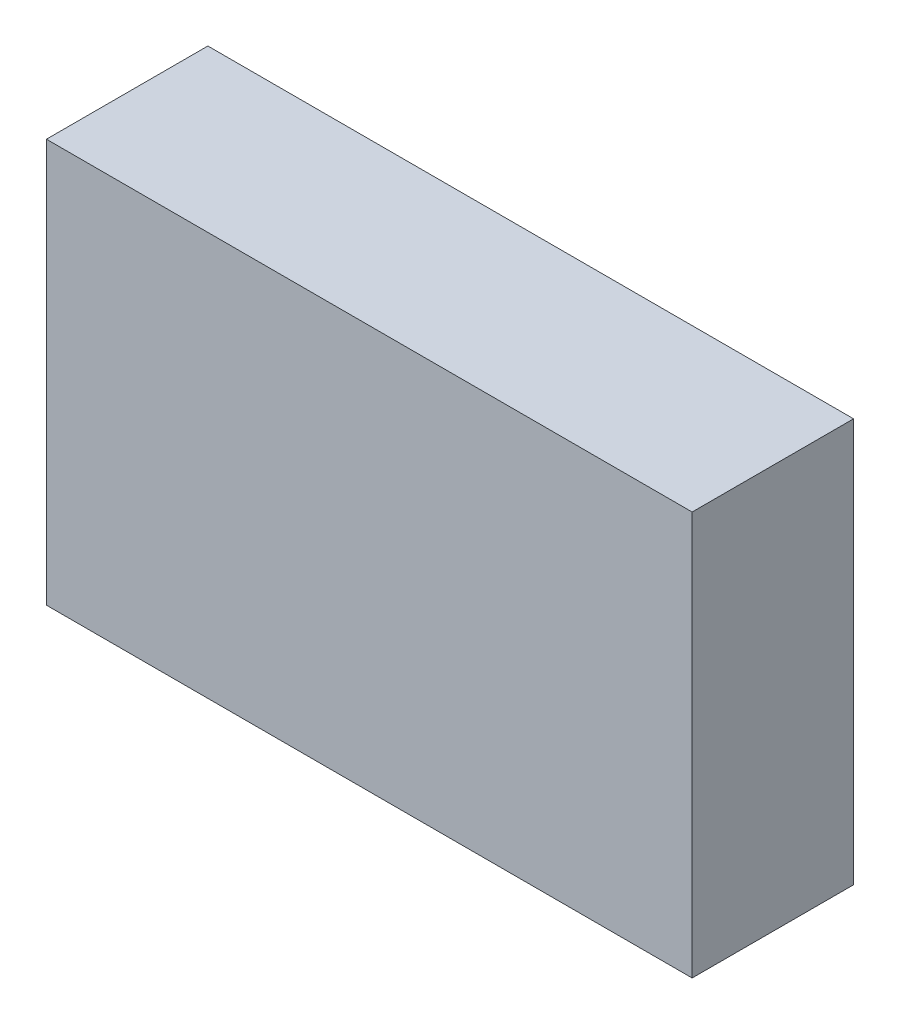
ISO-10303-21;
HEADER;
FILE_DESCRIPTION(('STEP AP214'),'2;1');
FILE_NAME('part.step','',(''),(''),'','','');
FILE_SCHEMA(('AUTOMOTIVE_DESIGN { 1 0 10303 214 1 1 1 1 }'));
ENDSEC;
DATA;
#1=APPLICATION_CONTEXT('core data for automotive mechanical design processes');
#2=APPLICATION_PROTOCOL_DEFINITION('international standard','automotive_design',2000,#1);
#3=PRODUCT_CONTEXT('',#1,'mechanical');
#4=PRODUCT('Part','Part','',(#3));
#5=PRODUCT_RELATED_PRODUCT_CATEGORY('part','',(#4));
#6=PRODUCT_DEFINITION_FORMATION('','',#4);
#7=PRODUCT_DEFINITION_CONTEXT('part definition',#1,'design');
#8=PRODUCT_DEFINITION('design','',#6,#7);
#9=PRODUCT_DEFINITION_SHAPE('','',#8);
#10=(LENGTH_UNIT() NAMED_UNIT(*) SI_UNIT(.MILLI.,.METRE.));
#11=(NAMED_UNIT(*) PLANE_ANGLE_UNIT() SI_UNIT($,.RADIAN.));
#12=(NAMED_UNIT(*) SI_UNIT($,.STERADIAN.) SOLID_ANGLE_UNIT());
#13=UNCERTAINTY_MEASURE_WITH_UNIT(LENGTH_MEASURE(1.E-05),#10,'distance_accuracy_value','');
#14=(GEOMETRIC_REPRESENTATION_CONTEXT(3) GLOBAL_UNCERTAINTY_ASSIGNED_CONTEXT((#13)) GLOBAL_UNIT_ASSIGNED_CONTEXT((#10,
#11,#12)) REPRESENTATION_CONTEXT('',''));
#15=CARTESIAN_POINT('',(0.,0.,0.));
#16=DIRECTION('',(0.,0.,1.));
#17=DIRECTION('',(1.,0.,0.));
#18=AXIS2_PLACEMENT_3D('',#15,#16,#17);
#19=CARTESIAN_POINT('',(-20.,0.,10.));
#20=DIRECTION('',(-1.,0.,0.));
#21=DIRECTION('',(0.,0.,1.));
#22=AXIS2_PLACEMENT_3D('',#19,#20,#21);
#23=PLANE('',#22);
#24=DIRECTION('',(0.,1.,0.));
#25=VECTOR('',#24,1.);
#26=CARTESIAN_POINT('',(-20.,0.,0.));
#27=LINE('',#26,#25);
#28=CARTESIAN_POINT('',(-20.,0.,0.));
#29=VERTEX_POINT('',#28);
#30=CARTESIAN_POINT('',(-20.,25.,0.));
#31=VERTEX_POINT('',#30);
#32=EDGE_CURVE('E106',#29,#31,#27,.T.);
#33=ORIENTED_EDGE('',*,*,#32,.F.);
#34=DIRECTION('',(0.,0.,-1.));
#35=VECTOR('',#34,1.);
#36=CARTESIAN_POINT('',(-20.,0.,10.));
#37=LINE('',#36,#35);
#38=CARTESIAN_POINT('',(-20.,0.,10.));
#39=VERTEX_POINT('',#38);
#40=EDGE_CURVE('E11',#39,#29,#37,.T.);
#41=ORIENTED_EDGE('',*,*,#40,.F.);
#42=DIRECTION('',(0.,1.,0.));
#43=VECTOR('',#42,1.);
#44=CARTESIAN_POINT('',(-20.,0.,10.));
#45=LINE('',#44,#43);
#46=CARTESIAN_POINT('',(-20.,25.,10.));
#47=VERTEX_POINT('',#46);
#48=EDGE_CURVE('E101',#39,#47,#45,.T.);
#49=ORIENTED_EDGE('',*,*,#48,.T.);
#50=DIRECTION('',(0.,0.,-1.));
#51=VECTOR('',#50,1.);
#52=CARTESIAN_POINT('',(-20.,25.,10.));
#53=LINE('',#52,#51);
#54=EDGE_CURVE('E44',#47,#31,#53,.T.);
#55=ORIENTED_EDGE('',*,*,#54,.T.);
#56=EDGE_LOOP('',(#33,#41,#49,#55));
#57=FACE_BOUND('',#56,.T.);
#58=ADVANCED_FACE('F41',(#57),#23,.T.);
#59=CARTESIAN_POINT('',(-20.,0.,10.));
#60=DIRECTION('',(0.,1.,0.));
#61=DIRECTION('',(0.,0.,1.));
#62=AXIS2_PLACEMENT_3D('',#59,#60,#61);
#63=PLANE('',#62);
#64=DIRECTION('',(1.,0.,0.));
#65=VECTOR('',#64,1.);
#66=CARTESIAN_POINT('',(-20.,0.,0.));
#67=LINE('',#66,#65);
#68=CARTESIAN_POINT('',(20.,0.,0.));
#69=VERTEX_POINT('',#68);
#70=EDGE_CURVE('E74',#29,#69,#67,.T.);
#71=ORIENTED_EDGE('',*,*,#70,.T.);
#72=DIRECTION('',(0.,0.,-1.));
#73=VECTOR('',#72,1.);
#74=CARTESIAN_POINT('',(20.,0.,10.));
#75=LINE('',#74,#73);
#76=CARTESIAN_POINT('',(20.,0.,10.));
#77=VERTEX_POINT('',#76);
#78=EDGE_CURVE('E50',#77,#69,#75,.T.);
#79=ORIENTED_EDGE('',*,*,#78,.F.);
#80=DIRECTION('',(1.,0.,0.));
#81=VECTOR('',#80,1.);
#82=CARTESIAN_POINT('',(-20.,0.,10.));
#83=LINE('',#82,#81);
#84=EDGE_CURVE('E91',#39,#77,#83,.T.);
#85=ORIENTED_EDGE('',*,*,#84,.F.);
#86=ORIENTED_EDGE('',*,*,#40,.T.);
#87=EDGE_LOOP('',(#71,#79,#85,#86));
#88=FACE_BOUND('',#87,.T.);
#89=ADVANCED_FACE('F116',(#88),#63,.F.);
#90=CARTESIAN_POINT('',(20.,0.,10.));
#91=DIRECTION('',(-1.,0.,0.));
#92=DIRECTION('',(0.,0.,1.));
#93=AXIS2_PLACEMENT_3D('',#90,#91,#92);
#94=PLANE('',#93);
#95=DIRECTION('',(0.,1.,0.));
#96=VECTOR('',#95,1.);
#97=CARTESIAN_POINT('',(20.,0.,0.));
#98=LINE('',#97,#96);
#99=CARTESIAN_POINT('',(20.,25.,0.));
#100=VERTEX_POINT('',#99);
#101=EDGE_CURVE('E98',#69,#100,#98,.T.);
#102=ORIENTED_EDGE('',*,*,#101,.T.);
#103=DIRECTION('',(0.,0.,-1.));
#104=VECTOR('',#103,1.);
#105=CARTESIAN_POINT('',(20.,25.,10.));
#106=LINE('',#105,#104);
#107=CARTESIAN_POINT('',(20.,25.,10.));
#108=VERTEX_POINT('',#107);
#109=EDGE_CURVE('E95',#108,#100,#106,.T.);
#110=ORIENTED_EDGE('',*,*,#109,.F.);
#111=DIRECTION('',(0.,1.,0.));
#112=VECTOR('',#111,1.);
#113=CARTESIAN_POINT('',(20.,0.,10.));
#114=LINE('',#113,#112);
#115=EDGE_CURVE('E86',#77,#108,#114,.T.);
#116=ORIENTED_EDGE('',*,*,#115,.F.);
#117=ORIENTED_EDGE('',*,*,#78,.T.);
#118=EDGE_LOOP('',(#102,#110,#116,#117));
#119=FACE_BOUND('',#118,.T.);
#120=ADVANCED_FACE('F96',(#119),#94,.F.);
#121=CARTESIAN_POINT('',(-20.,25.,10.));
#122=DIRECTION('',(0.,1.,0.));
#123=DIRECTION('',(0.,0.,1.));
#124=AXIS2_PLACEMENT_3D('',#121,#122,#123);
#125=PLANE('',#124);
#126=DIRECTION('',(1.,0.,0.));
#127=VECTOR('',#126,1.);
#128=CARTESIAN_POINT('',(-20.,25.,0.));
#129=LINE('',#128,#127);
#130=EDGE_CURVE('E109',#31,#100,#129,.T.);
#131=ORIENTED_EDGE('',*,*,#130,.F.);
#132=ORIENTED_EDGE('',*,*,#54,.F.);
#133=DIRECTION('',(1.,0.,0.));
#134=VECTOR('',#133,1.);
#135=CARTESIAN_POINT('',(-20.,25.,10.));
#136=LINE('',#135,#134);
#137=EDGE_CURVE('E90',#47,#108,#136,.T.);
#138=ORIENTED_EDGE('',*,*,#137,.T.);
#139=ORIENTED_EDGE('',*,*,#109,.T.);
#140=EDGE_LOOP('',(#131,#132,#138,#139));
#141=FACE_BOUND('',#140,.T.);
#142=ADVANCED_FACE('F100',(#141),#125,.T.);
#143=CARTESIAN_POINT('',(0.,0.,10.));
#144=DIRECTION('',(0.,0.,-1.));
#145=DIRECTION('',(-1.,0.,0.));
#146=AXIS2_PLACEMENT_3D('',#143,#144,#145);
#147=PLANE('',#146);
#148=ORIENTED_EDGE('',*,*,#48,.F.);
#149=ORIENTED_EDGE('',*,*,#84,.T.);
#150=ORIENTED_EDGE('',*,*,#115,.T.);
#151=ORIENTED_EDGE('',*,*,#137,.F.);
#152=EDGE_LOOP('',(#148,#149,#150,#151));
#153=FACE_BOUND('',#152,.T.);
#154=ADVANCED_FACE('F89',(#153),#147,.F.);
#155=CARTESIAN_POINT('',(0.,0.,0.));
#156=DIRECTION('',(0.,0.,-1.));
#157=DIRECTION('',(-1.,0.,0.));
#158=AXIS2_PLACEMENT_3D('',#155,#156,#157);
#159=PLANE('',#158);
#160=ORIENTED_EDGE('',*,*,#32,.T.);
#161=ORIENTED_EDGE('',*,*,#130,.T.);
#162=ORIENTED_EDGE('',*,*,#101,.F.);
#163=ORIENTED_EDGE('',*,*,#70,.F.);
#164=EDGE_LOOP('',(#160,#161,#162,#163));
#165=FACE_BOUND('',#164,.T.);
#166=ADVANCED_FACE('F114',(#165),#159,.T.);
#167=CLOSED_SHELL('',(#58,#89,#120,#142,#154,#166));
#168=MANIFOLD_SOLID_BREP('B2',#167);
#169=ADVANCED_BREP_SHAPE_REPRESENTATION('',(#18,#168),#14);
#170=SHAPE_DEFINITION_REPRESENTATION(#9,#169);
ENDSEC;
END-ISO-10303-21;
